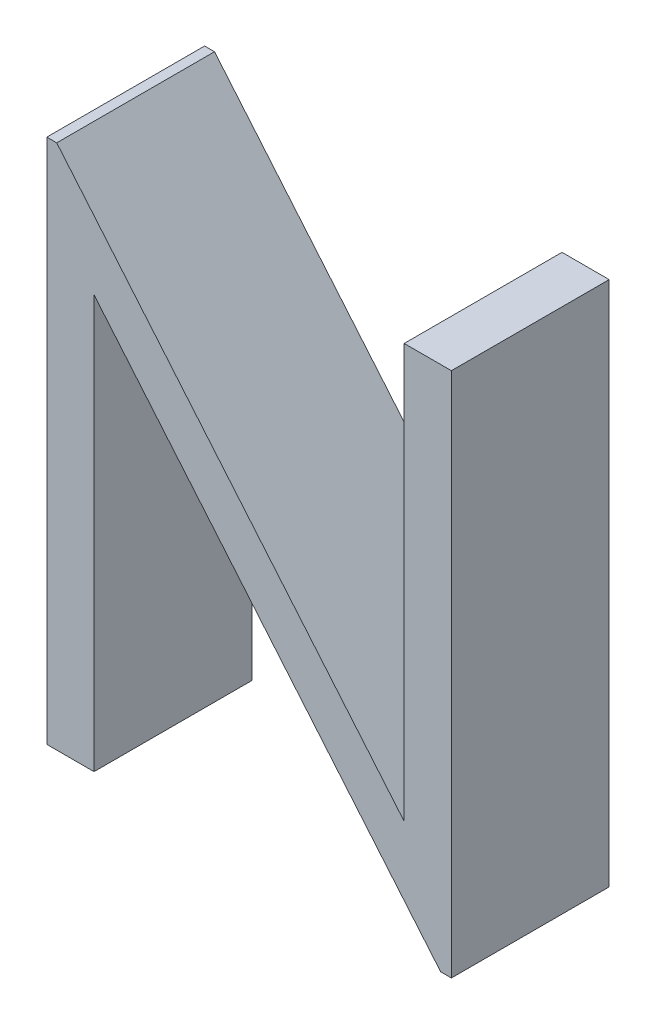
ISO-10303-21;
HEADER;
FILE_DESCRIPTION(('STEP AP214'),'2;1');
FILE_NAME('part.step','',(''),(''),'','','');
FILE_SCHEMA(('AUTOMOTIVE_DESIGN { 1 0 10303 214 1 1 1 1 }'));
ENDSEC;
DATA;
#1=APPLICATION_CONTEXT('core data for automotive mechanical design processes');
#2=APPLICATION_PROTOCOL_DEFINITION('international standard','automotive_design',2000,#1);
#3=PRODUCT_CONTEXT('',#1,'mechanical');
#4=PRODUCT('Part','Part','',(#3));
#5=PRODUCT_RELATED_PRODUCT_CATEGORY('part','',(#4));
#6=PRODUCT_DEFINITION_FORMATION('','',#4);
#7=PRODUCT_DEFINITION_CONTEXT('part definition',#1,'design');
#8=PRODUCT_DEFINITION('design','',#6,#7);
#9=PRODUCT_DEFINITION_SHAPE('','',#8);
#10=(LENGTH_UNIT() NAMED_UNIT(*) SI_UNIT(.MILLI.,.METRE.));
#11=(NAMED_UNIT(*) PLANE_ANGLE_UNIT() SI_UNIT($,.RADIAN.));
#12=(NAMED_UNIT(*) SI_UNIT($,.STERADIAN.) SOLID_ANGLE_UNIT());
#13=UNCERTAINTY_MEASURE_WITH_UNIT(LENGTH_MEASURE(1.E-05),#10,'distance_accuracy_value','');
#14=(GEOMETRIC_REPRESENTATION_CONTEXT(3) GLOBAL_UNCERTAINTY_ASSIGNED_CONTEXT((#13)) GLOBAL_UNIT_ASSIGNED_CONTEXT((#10,
#11,#12)) REPRESENTATION_CONTEXT('',''));
#15=CARTESIAN_POINT('',(0.,0.,0.));
#16=DIRECTION('',(0.,0.,1.));
#17=DIRECTION('',(1.,0.,0.));
#18=AXIS2_PLACEMENT_3D('',#15,#16,#17);
#19=CARTESIAN_POINT('',(-54.9837473771516,-22.8701190762308,1.5));
#20=DIRECTION('',(0.,-1.,0.));
#21=DIRECTION('',(0.,0.,-1.));
#22=AXIS2_PLACEMENT_3D('',#19,#20,#21);
#23=PLANE('',#22);
#24=DIRECTION('',(-1.,0.,0.));
#25=VECTOR('',#24,1.);
#26=CARTESIAN_POINT('',(-54.9837473771516,-22.8701190762308,0.));
#27=LINE('',#26,#25);
#28=CARTESIAN_POINT('',(-54.9837473771516,-22.8701190762308,0.));
#29=VERTEX_POINT('',#28);
#30=CARTESIAN_POINT('',(-55.4324653258695,-22.8701190762308,0.));
#31=VERTEX_POINT('',#30);
#32=EDGE_CURVE('E142',#29,#31,#27,.T.);
#33=ORIENTED_EDGE('',*,*,#32,.F.);
#34=DIRECTION('',(0.,0.,-1.));
#35=VECTOR('',#34,1.);
#36=CARTESIAN_POINT('',(-54.9837473771516,-22.8701190762308,1.5));
#37=LINE('',#36,#35);
#38=CARTESIAN_POINT('',(-54.9837473771516,-22.8701190762308,1.5));
#39=VERTEX_POINT('',#38);
#40=EDGE_CURVE('E11',#39,#29,#37,.T.);
#41=ORIENTED_EDGE('',*,*,#40,.F.);
#42=DIRECTION('',(-1.,0.,0.));
#43=VECTOR('',#42,1.);
#44=CARTESIAN_POINT('',(-54.9837473771516,-22.8701190762308,1.5));
#45=LINE('',#44,#43);
#46=CARTESIAN_POINT('',(-55.4324653258695,-22.8701190762308,1.5));
#47=VERTEX_POINT('',#46);
#48=EDGE_CURVE('E168',#39,#47,#45,.T.);
#49=ORIENTED_EDGE('',*,*,#48,.T.);
#50=DIRECTION('',(0.,0.,-1.));
#51=VECTOR('',#50,1.);
#52=CARTESIAN_POINT('',(-55.4324653258695,-22.8701190762308,1.5));
#53=LINE('',#52,#51);
#54=EDGE_CURVE('E36',#47,#31,#53,.T.);
#55=ORIENTED_EDGE('',*,*,#54,.T.);
#56=EDGE_LOOP('',(#33,#41,#49,#55));
#57=FACE_BOUND('',#56,.T.);
#58=ADVANCED_FACE('F33',(#57),#23,.T.);
#59=CARTESIAN_POINT('',(-54.9837473771516,-18.9438370249488,1.5));
#60=DIRECTION('',(1.,0.,0.));
#61=DIRECTION('',(0.,0.,-1.));
#62=AXIS2_PLACEMENT_3D('',#59,#60,#61);
#63=PLANE('',#62);
#64=DIRECTION('',(0.,-1.,0.));
#65=VECTOR('',#64,1.);
#66=CARTESIAN_POINT('',(-54.9837473771516,-18.9438370249488,0.));
#67=LINE('',#66,#65);
#68=CARTESIAN_POINT('',(-54.9837473771516,-18.9438370249488,0.));
#69=VERTEX_POINT('',#68);
#70=EDGE_CURVE('E166',#69,#29,#67,.T.);
#71=ORIENTED_EDGE('',*,*,#70,.F.);
#72=DIRECTION('',(0.,0.,-1.));
#73=VECTOR('',#72,1.);
#74=CARTESIAN_POINT('',(-54.9837473771516,-18.9438370249488,1.5));
#75=LINE('',#74,#73);
#76=CARTESIAN_POINT('',(-54.9837473771516,-18.9438370249488,1.5));
#77=VERTEX_POINT('',#76);
#78=EDGE_CURVE('E42',#77,#69,#75,.T.);
#79=ORIENTED_EDGE('',*,*,#78,.F.);
#80=DIRECTION('',(0.,-1.,0.));
#81=VECTOR('',#80,1.);
#82=CARTESIAN_POINT('',(-54.9837473771516,-18.9438370249488,1.5));
#83=LINE('',#82,#81);
#84=EDGE_CURVE('E132',#77,#39,#83,.T.);
#85=ORIENTED_EDGE('',*,*,#84,.T.);
#86=ORIENTED_EDGE('',*,*,#40,.T.);
#87=EDGE_LOOP('',(#71,#79,#85,#86));
#88=FACE_BOUND('',#87,.T.);
#89=ADVANCED_FACE('F184',(#88),#63,.T.);
#90=CARTESIAN_POINT('',(-51.6884749412542,-22.8701190762308,1.5));
#91=DIRECTION('',(-0.765974253829985,-0.642871248750165,0.));
#92=DIRECTION('',(0.642871248750166,-0.765974253829986,0.));
#93=AXIS2_PLACEMENT_3D('',#90,#91,#92);
#94=PLANE('',#93);
#95=DIRECTION('',(-0.642871248750165,0.765974253829985,0.));
#96=VECTOR('',#95,1.);
#97=CARTESIAN_POINT('',(-51.6884749412542,-22.8701190762308,0.));
#98=LINE('',#97,#96);
#99=CARTESIAN_POINT('',(-51.6884749412542,-22.8701190762308,0.));
#100=VERTEX_POINT('',#99);
#101=EDGE_CURVE('E119',#100,#69,#98,.T.);
#102=ORIENTED_EDGE('',*,*,#101,.F.);
#103=DIRECTION('',(0.,0.,-1.));
#104=VECTOR('',#103,1.);
#105=CARTESIAN_POINT('',(-51.6884749412542,-22.8701190762308,1.5));
#106=LINE('',#105,#104);
#107=CARTESIAN_POINT('',(-51.6884749412542,-22.8701190762308,1.5));
#108=VERTEX_POINT('',#107);
#109=EDGE_CURVE('E114',#108,#100,#106,.T.);
#110=ORIENTED_EDGE('',*,*,#109,.F.);
#111=DIRECTION('',(-0.642871248750165,0.765974253829985,0.));
#112=VECTOR('',#111,1.);
#113=CARTESIAN_POINT('',(-51.6884749412542,-22.8701190762308,1.5));
#114=LINE('',#113,#112);
#115=EDGE_CURVE('E117',#108,#77,#114,.T.);
#116=ORIENTED_EDGE('',*,*,#115,.T.);
#117=ORIENTED_EDGE('',*,*,#78,.T.);
#118=EDGE_LOOP('',(#102,#110,#116,#117));
#119=FACE_BOUND('',#118,.T.);
#120=ADVANCED_FACE('F116',(#119),#94,.T.);
#121=CARTESIAN_POINT('',(-51.5863114797157,-22.8701190762308,1.5));
#122=DIRECTION('',(0.,-1.,0.));
#123=DIRECTION('',(0.,0.,-1.));
#124=AXIS2_PLACEMENT_3D('',#121,#122,#123);
#125=PLANE('',#124);
#126=DIRECTION('',(-1.,0.,0.));
#127=VECTOR('',#126,1.);
#128=CARTESIAN_POINT('',(-51.5863114797157,-22.8701190762308,0.));
#129=LINE('',#128,#127);
#130=CARTESIAN_POINT('',(-51.5863114797157,-22.8701190762308,0.));
#131=VERTEX_POINT('',#130);
#132=EDGE_CURVE('E163',#131,#100,#129,.T.);
#133=ORIENTED_EDGE('',*,*,#132,.F.);
#134=DIRECTION('',(0.,0.,-1.));
#135=VECTOR('',#134,1.);
#136=CARTESIAN_POINT('',(-51.5863114797157,-22.8701190762308,1.5));
#137=LINE('',#136,#135);
#138=CARTESIAN_POINT('',(-51.5863114797157,-22.8701190762308,1.5));
#139=VERTEX_POINT('',#138);
#140=EDGE_CURVE('E124',#139,#131,#137,.T.);
#141=ORIENTED_EDGE('',*,*,#140,.F.);
#142=DIRECTION('',(-1.,0.,0.));
#143=VECTOR('',#142,1.);
#144=CARTESIAN_POINT('',(-51.5863114797157,-22.8701190762308,1.5));
#145=LINE('',#144,#143);
#146=EDGE_CURVE('E130',#139,#108,#145,.T.);
#147=ORIENTED_EDGE('',*,*,#146,.T.);
#148=ORIENTED_EDGE('',*,*,#109,.T.);
#149=EDGE_LOOP('',(#133,#141,#147,#148));
#150=FACE_BOUND('',#149,.T.);
#151=ADVANCED_FACE('F134',(#150),#125,.T.);
#152=CARTESIAN_POINT('',(-51.5863114797157,-17.8701190762308,1.5));
#153=DIRECTION('',(1.,0.,0.));
#154=DIRECTION('',(0.,0.,-1.));
#155=AXIS2_PLACEMENT_3D('',#152,#153,#154);
#156=PLANE('',#155);
#157=DIRECTION('',(0.,-1.,0.));
#158=VECTOR('',#157,1.);
#159=CARTESIAN_POINT('',(-51.5863114797157,-17.8701190762308,0.));
#160=LINE('',#159,#158);
#161=CARTESIAN_POINT('',(-51.5863114797157,-17.8701190762308,0.));
#162=VERTEX_POINT('',#161);
#163=EDGE_CURVE('E160',#162,#131,#160,.T.);
#164=ORIENTED_EDGE('',*,*,#163,.F.);
#165=DIRECTION('',(0.,0.,-1.));
#166=VECTOR('',#165,1.);
#167=CARTESIAN_POINT('',(-51.5863114797157,-17.8701190762308,1.5));
#168=LINE('',#167,#166);
#169=CARTESIAN_POINT('',(-51.5863114797157,-17.8701190762308,1.5));
#170=VERTEX_POINT('',#169);
#171=EDGE_CURVE('E172',#170,#162,#168,.T.);
#172=ORIENTED_EDGE('',*,*,#171,.F.);
#173=DIRECTION('',(0.,-1.,0.));
#174=VECTOR('',#173,1.);
#175=CARTESIAN_POINT('',(-51.5863114797157,-17.8701190762308,1.5));
#176=LINE('',#175,#174);
#177=EDGE_CURVE('E135',#170,#139,#176,.T.);
#178=ORIENTED_EDGE('',*,*,#177,.T.);
#179=ORIENTED_EDGE('',*,*,#140,.T.);
#180=EDGE_LOOP('',(#164,#172,#178,#179));
#181=FACE_BOUND('',#180,.T.);
#182=ADVANCED_FACE('F197',(#181),#156,.T.);
#183=CARTESIAN_POINT('',(-52.0350294284336,-17.8701190762308,1.5));
#184=DIRECTION('',(0.,1.,0.));
#185=DIRECTION('',(0.,0.,1.));
#186=AXIS2_PLACEMENT_3D('',#183,#184,#185);
#187=PLANE('',#186);
#188=DIRECTION('',(1.,0.,0.));
#189=VECTOR('',#188,1.);
#190=CARTESIAN_POINT('',(-52.0350294284336,-17.8701190762308,0.));
#191=LINE('',#190,#189);
#192=CARTESIAN_POINT('',(-52.0350294284336,-17.8701190762308,0.));
#193=VERTEX_POINT('',#192);
#194=EDGE_CURVE('E157',#193,#162,#191,.T.);
#195=ORIENTED_EDGE('',*,*,#194,.F.);
#196=DIRECTION('',(0.,0.,-1.));
#197=VECTOR('',#196,1.);
#198=CARTESIAN_POINT('',(-52.0350294284336,-17.8701190762308,1.5));
#199=LINE('',#198,#197);
#200=CARTESIAN_POINT('',(-52.0350294284336,-17.8701190762308,1.5));
#201=VERTEX_POINT('',#200);
#202=EDGE_CURVE('E174',#201,#193,#199,.T.);
#203=ORIENTED_EDGE('',*,*,#202,.F.);
#204=DIRECTION('',(1.,0.,0.));
#205=VECTOR('',#204,1.);
#206=CARTESIAN_POINT('',(-52.0350294284336,-17.8701190762308,1.5));
#207=LINE('',#206,#205);
#208=EDGE_CURVE('E137',#201,#170,#207,.T.);
#209=ORIENTED_EDGE('',*,*,#208,.T.);
#210=ORIENTED_EDGE('',*,*,#171,.T.);
#211=EDGE_LOOP('',(#195,#203,#209,#210));
#212=FACE_BOUND('',#211,.T.);
#213=ADVANCED_FACE('F200',(#212),#187,.T.);
#214=CARTESIAN_POINT('',(-52.0350294284336,-21.8054155505898,1.5));
#215=DIRECTION('',(-1.,0.,0.));
#216=DIRECTION('',(0.,0.,1.));
#217=AXIS2_PLACEMENT_3D('',#214,#215,#216);
#218=PLANE('',#217);
#219=DIRECTION('',(0.,1.,0.));
#220=VECTOR('',#219,1.);
#221=CARTESIAN_POINT('',(-52.0350294284336,-21.8054155505898,0.));
#222=LINE('',#221,#220);
#223=CARTESIAN_POINT('',(-52.0350294284336,-21.8054155505898,0.));
#224=VERTEX_POINT('',#223);
#225=EDGE_CURVE('E154',#224,#193,#222,.T.);
#226=ORIENTED_EDGE('',*,*,#225,.F.);
#227=DIRECTION('',(0.,0.,-1.));
#228=VECTOR('',#227,1.);
#229=CARTESIAN_POINT('',(-52.0350294284336,-21.8054155505898,1.5));
#230=LINE('',#229,#228);
#231=CARTESIAN_POINT('',(-52.0350294284336,-21.8054155505898,1.5));
#232=VERTEX_POINT('',#231);
#233=EDGE_CURVE('E176',#232,#224,#230,.T.);
#234=ORIENTED_EDGE('',*,*,#233,.F.);
#235=DIRECTION('',(0.,1.,0.));
#236=VECTOR('',#235,1.);
#237=CARTESIAN_POINT('',(-52.0350294284336,-21.8054155505898,1.5));
#238=LINE('',#237,#236);
#239=EDGE_CURVE('E317',#232,#201,#238,.T.);
#240=ORIENTED_EDGE('',*,*,#239,.T.);
#241=ORIENTED_EDGE('',*,*,#202,.T.);
#242=EDGE_LOOP('',(#226,#234,#240,#241));
#243=FACE_BOUND('',#242,.T.);
#244=ADVANCED_FACE('F204',(#243),#218,.T.);
#245=CARTESIAN_POINT('',(-55.3383146848439,-17.8701190762308,1.5));
#246=DIRECTION('',(0.76593139747331,0.642922308187064,0.));
#247=DIRECTION('',(-0.642922308187064,0.76593139747331,0.));
#248=AXIS2_PLACEMENT_3D('',#245,#246,#247);
#249=PLANE('',#248);
#250=DIRECTION('',(0.642922308187064,-0.76593139747331,0.));
#251=VECTOR('',#250,1.);
#252=CARTESIAN_POINT('',(-55.3383146848439,-17.8701190762308,0.));
#253=LINE('',#252,#251);
#254=CARTESIAN_POINT('',(-55.3383146848439,-17.8701190762308,0.));
#255=VERTEX_POINT('',#254);
#256=EDGE_CURVE('E151',#255,#224,#253,.T.);
#257=ORIENTED_EDGE('',*,*,#256,.F.);
#258=DIRECTION('',(0.,0.,-1.));
#259=VECTOR('',#258,1.);
#260=CARTESIAN_POINT('',(-55.3383146848439,-17.8701190762308,1.5));
#261=LINE('',#260,#259);
#262=CARTESIAN_POINT('',(-55.3383146848439,-17.8701190762308,1.5));
#263=VERTEX_POINT('',#262);
#264=EDGE_CURVE('E178',#263,#255,#261,.T.);
#265=ORIENTED_EDGE('',*,*,#264,.F.);
#266=DIRECTION('',(0.642922308187064,-0.76593139747331,0.));
#267=VECTOR('',#266,1.);
#268=CARTESIAN_POINT('',(-55.3383146848439,-17.8701190762308,1.5));
#269=LINE('',#268,#267);
#270=EDGE_CURVE('E313',#263,#232,#269,.T.);
#271=ORIENTED_EDGE('',*,*,#270,.T.);
#272=ORIENTED_EDGE('',*,*,#233,.T.);
#273=EDGE_LOOP('',(#257,#265,#271,#272));
#274=FACE_BOUND('',#273,.T.);
#275=ADVANCED_FACE('F208',(#274),#249,.T.);
#276=CARTESIAN_POINT('',(-55.4324653258695,-17.8701190762308,1.5));
#277=DIRECTION('',(0.,1.,0.));
#278=DIRECTION('',(0.,0.,1.));
#279=AXIS2_PLACEMENT_3D('',#276,#277,#278);
#280=PLANE('',#279);
#281=DIRECTION('',(1.,0.,0.));
#282=VECTOR('',#281,1.);
#283=CARTESIAN_POINT('',(-55.4324653258695,-17.8701190762308,0.));
#284=LINE('',#283,#282);
#285=CARTESIAN_POINT('',(-55.4324653258695,-17.8701190762308,0.));
#286=VERTEX_POINT('',#285);
#287=EDGE_CURVE('E148',#286,#255,#284,.T.);
#288=ORIENTED_EDGE('',*,*,#287,.F.);
#289=DIRECTION('',(0.,0.,-1.));
#290=VECTOR('',#289,1.);
#291=CARTESIAN_POINT('',(-55.4324653258695,-17.8701190762308,1.5));
#292=LINE('',#291,#290);
#293=CARTESIAN_POINT('',(-55.4324653258695,-17.8701190762308,1.5));
#294=VERTEX_POINT('',#293);
#295=EDGE_CURVE('E179',#294,#286,#292,.T.);
#296=ORIENTED_EDGE('',*,*,#295,.F.);
#297=DIRECTION('',(1.,0.,0.));
#298=VECTOR('',#297,1.);
#299=CARTESIAN_POINT('',(-55.4324653258695,-17.8701190762308,1.5));
#300=LINE('',#299,#298);
#301=EDGE_CURVE('E324',#294,#263,#300,.T.);
#302=ORIENTED_EDGE('',*,*,#301,.T.);
#303=ORIENTED_EDGE('',*,*,#264,.T.);
#304=EDGE_LOOP('',(#288,#296,#302,#303));
#305=FACE_BOUND('',#304,.T.);
#306=ADVANCED_FACE('F212',(#305),#280,.T.);
#307=CARTESIAN_POINT('',(-55.4324653258695,-22.8701190762308,1.5));
#308=DIRECTION('',(-1.,0.,0.));
#309=DIRECTION('',(0.,0.,1.));
#310=AXIS2_PLACEMENT_3D('',#307,#308,#309);
#311=PLANE('',#310);
#312=DIRECTION('',(0.,1.,0.));
#313=VECTOR('',#312,1.);
#314=CARTESIAN_POINT('',(-55.4324653258695,-22.8701190762308,0.));
#315=LINE('',#314,#313);
#316=EDGE_CURVE('E145',#31,#286,#315,.T.);
#317=ORIENTED_EDGE('',*,*,#316,.F.);
#318=ORIENTED_EDGE('',*,*,#54,.F.);
#319=DIRECTION('',(0.,1.,0.));
#320=VECTOR('',#319,1.);
#321=CARTESIAN_POINT('',(-55.4324653258695,-22.8701190762308,1.5));
#322=LINE('',#321,#320);
#323=EDGE_CURVE('E326',#47,#294,#322,.T.);
#324=ORIENTED_EDGE('',*,*,#323,.T.);
#325=ORIENTED_EDGE('',*,*,#295,.T.);
#326=EDGE_LOOP('',(#317,#318,#324,#325));
#327=FACE_BOUND('',#326,.T.);
#328=ADVANCED_FACE('F181',(#327),#311,.T.);
#329=CARTESIAN_POINT('',(0.,0.,1.5));
#330=DIRECTION('',(0.,0.,-1.));
#331=DIRECTION('',(-1.,0.,0.));
#332=AXIS2_PLACEMENT_3D('',#329,#330,#331);
#333=PLANE('',#332);
#334=ORIENTED_EDGE('',*,*,#48,.F.);
#335=ORIENTED_EDGE('',*,*,#84,.F.);
#336=ORIENTED_EDGE('',*,*,#115,.F.);
#337=ORIENTED_EDGE('',*,*,#146,.F.);
#338=ORIENTED_EDGE('',*,*,#177,.F.);
#339=ORIENTED_EDGE('',*,*,#208,.F.);
#340=ORIENTED_EDGE('',*,*,#239,.F.);
#341=ORIENTED_EDGE('',*,*,#270,.F.);
#342=ORIENTED_EDGE('',*,*,#301,.F.);
#343=ORIENTED_EDGE('',*,*,#323,.F.);
#344=EDGE_LOOP('',(#334,#335,#336,#337,#338,#339,#340,#341,#342,#343));
#345=FACE_BOUND('',#344,.T.);
#346=ADVANCED_FACE('F128',(#345),#333,.F.);
#347=CARTESIAN_POINT('',(0.,0.,0.));
#348=DIRECTION('',(0.,0.,-1.));
#349=DIRECTION('',(-1.,0.,0.));
#350=AXIS2_PLACEMENT_3D('',#347,#348,#349);
#351=PLANE('',#350);
#352=ORIENTED_EDGE('',*,*,#32,.T.);
#353=ORIENTED_EDGE('',*,*,#316,.T.);
#354=ORIENTED_EDGE('',*,*,#287,.T.);
#355=ORIENTED_EDGE('',*,*,#256,.T.);
#356=ORIENTED_EDGE('',*,*,#225,.T.);
#357=ORIENTED_EDGE('',*,*,#194,.T.);
#358=ORIENTED_EDGE('',*,*,#163,.T.);
#359=ORIENTED_EDGE('',*,*,#132,.T.);
#360=ORIENTED_EDGE('',*,*,#101,.T.);
#361=ORIENTED_EDGE('',*,*,#70,.T.);
#362=EDGE_LOOP('',(#352,#353,#354,#355,#356,#357,#358,#359,#360,#361));
#363=FACE_BOUND('',#362,.T.);
#364=ADVANCED_FACE('F183',(#363),#351,.T.);
#365=CLOSED_SHELL('',(#58,#89,#120,#151,#182,#213,#244,#275,#306,#328,#346,#364));
#366=MANIFOLD_SOLID_BREP('B2',#365);
#367=ADVANCED_BREP_SHAPE_REPRESENTATION('',(#18,#366),#14);
#368=SHAPE_DEFINITION_REPRESENTATION(#9,#367);
ENDSEC;
END-ISO-10303-21;
